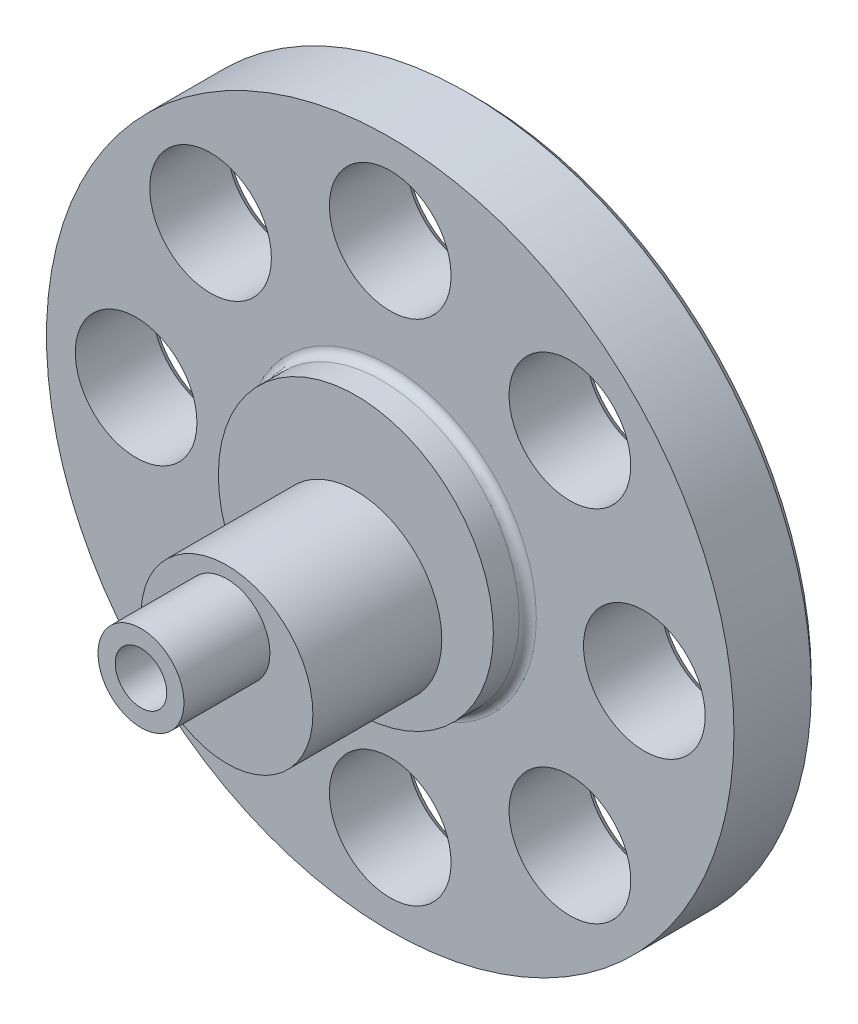
ISO-10303-21;
HEADER;
FILE_DESCRIPTION(('STEP AP214'),'2;1');
FILE_NAME('part.step','',(''),(''),'','','');
FILE_SCHEMA(('AUTOMOTIVE_DESIGN { 1 0 10303 214 1 1 1 1 }'));
ENDSEC;
DATA;
#1=APPLICATION_CONTEXT('core data for automotive mechanical design processes');
#2=APPLICATION_PROTOCOL_DEFINITION('international standard','automotive_design',2000,#1);
#3=PRODUCT_CONTEXT('',#1,'mechanical');
#4=PRODUCT('Part','Part','',(#3));
#5=PRODUCT_RELATED_PRODUCT_CATEGORY('part','',(#4));
#6=PRODUCT_DEFINITION_FORMATION('','',#4);
#7=PRODUCT_DEFINITION_CONTEXT('part definition',#1,'design');
#8=PRODUCT_DEFINITION('design','',#6,#7);
#9=PRODUCT_DEFINITION_SHAPE('','',#8);
#10=(LENGTH_UNIT() NAMED_UNIT(*) SI_UNIT(.MILLI.,.METRE.));
#11=(NAMED_UNIT(*) PLANE_ANGLE_UNIT() SI_UNIT($,.RADIAN.));
#12=(NAMED_UNIT(*) SI_UNIT($,.STERADIAN.) SOLID_ANGLE_UNIT());
#13=UNCERTAINTY_MEASURE_WITH_UNIT(LENGTH_MEASURE(1.E-05),#10,'distance_accuracy_value','');
#14=(GEOMETRIC_REPRESENTATION_CONTEXT(3) GLOBAL_UNCERTAINTY_ASSIGNED_CONTEXT((#13)) GLOBAL_UNIT_ASSIGNED_CONTEXT((#10,
#11,#12)) REPRESENTATION_CONTEXT('',''));
#15=CARTESIAN_POINT('',(0.,0.,0.));
#16=DIRECTION('',(0.,0.,1.));
#17=DIRECTION('',(1.,0.,0.));
#18=AXIS2_PLACEMENT_3D('',#15,#16,#17);
#19=CARTESIAN_POINT('',(0.,0.,5.));
#20=DIRECTION('',(0.,0.,1.));
#21=DIRECTION('',(1.,0.,0.));
#22=AXIS2_PLACEMENT_3D('',#19,#20,#21);
#23=PLANE('',#22);
#24=CARTESIAN_POINT('',(0.,0.,5.));
#25=DIRECTION('',(0.,0.,1.));
#26=DIRECTION('',(1.,0.,0.));
#27=AXIS2_PLACEMENT_3D('',#24,#25,#26);
#28=CIRCLE('',#27,8.5);
#29=CARTESIAN_POINT('',(8.5,0.,5.));
#30=VERTEX_POINT('',#29);
#31=EDGE_CURVE('E104',#30,#30,#28,.F.);
#32=ORIENTED_EDGE('',*,*,#31,.T.);
#33=EDGE_LOOP('',(#32));
#34=FACE_BOUND('',#33,.T.);
#35=CARTESIAN_POINT('',(0.,14.783956386368,5.));
#36=DIRECTION('',(0.,0.,1.));
#37=DIRECTION('',(1.,0.,0.));
#38=AXIS2_PLACEMENT_3D('',#35,#36,#37);
#39=CIRCLE('',#38,3.54);
#40=CARTESIAN_POINT('',(3.54,14.783956386368,5.));
#41=VERTEX_POINT('',#40);
#42=EDGE_CURVE('E133',#41,#41,#39,.T.);
#43=ORIENTED_EDGE('',*,*,#42,.F.);
#44=EDGE_LOOP('',(#43));
#45=FACE_BOUND('',#44,.T.);
#46=CARTESIAN_POINT('',(14.783956386368,0.,5.));
#47=DIRECTION('',(0.,0.,1.));
#48=DIRECTION('',(1.,0.,0.));
#49=AXIS2_PLACEMENT_3D('',#46,#47,#48);
#50=CIRCLE('',#49,3.54);
#51=CARTESIAN_POINT('',(18.323956386368,0.,5.));
#52=VERTEX_POINT('',#51);
#53=EDGE_CURVE('E127',#52,#52,#50,.T.);
#54=ORIENTED_EDGE('',*,*,#53,.F.);
#55=EDGE_LOOP('',(#54));
#56=FACE_BOUND('',#55,.T.);
#57=CARTESIAN_POINT('',(0.,-14.783956386368,5.));
#58=DIRECTION('',(0.,0.,1.));
#59=DIRECTION('',(1.,0.,0.));
#60=AXIS2_PLACEMENT_3D('',#57,#58,#59);
#61=CIRCLE('',#60,3.54);
#62=CARTESIAN_POINT('',(3.54,-14.783956386368,5.));
#63=VERTEX_POINT('',#62);
#64=EDGE_CURVE('E121',#63,#63,#61,.T.);
#65=ORIENTED_EDGE('',*,*,#64,.F.);
#66=EDGE_LOOP('',(#65));
#67=FACE_BOUND('',#66,.T.);
#68=CARTESIAN_POINT('',(-14.783956386368,0.,5.));
#69=DIRECTION('',(0.,0.,1.));
#70=DIRECTION('',(1.,0.,0.));
#71=AXIS2_PLACEMENT_3D('',#68,#69,#70);
#72=CIRCLE('',#71,3.54);
#73=CARTESIAN_POINT('',(-11.243956386368,0.,5.));
#74=VERTEX_POINT('',#73);
#75=EDGE_CURVE('E115',#74,#74,#72,.T.);
#76=ORIENTED_EDGE('',*,*,#75,.F.);
#77=EDGE_LOOP('',(#76));
#78=FACE_BOUND('',#77,.T.);
#79=CARTESIAN_POINT('',(0.,0.,5.));
#80=DIRECTION('',(0.,0.,1.));
#81=DIRECTION('',(1.,0.,0.));
#82=AXIS2_PLACEMENT_3D('',#79,#80,#81);
#83=CIRCLE('',#82,20.);
#84=CARTESIAN_POINT('',(20.,0.,5.));
#85=VERTEX_POINT('',#84);
#86=EDGE_CURVE('E111',#85,#85,#83,.T.);
#87=ORIENTED_EDGE('',*,*,#86,.T.);
#88=EDGE_LOOP('',(#87));
#89=FACE_BOUND('',#88,.T.);
#90=CARTESIAN_POINT('',(-10.453835813567,-10.453835813567,5.));
#91=DIRECTION('',(0.,0.,1.));
#92=DIRECTION('',(1.,0.,0.));
#93=AXIS2_PLACEMENT_3D('',#90,#91,#92);
#94=CIRCLE('',#93,3.54);
#95=CARTESIAN_POINT('',(-6.913835813567,-10.453835813567,5.));
#96=VERTEX_POINT('',#95);
#97=EDGE_CURVE('E118',#96,#96,#94,.T.);
#98=ORIENTED_EDGE('',*,*,#97,.F.);
#99=EDGE_LOOP('',(#98));
#100=FACE_BOUND('',#99,.T.);
#101=CARTESIAN_POINT('',(10.453835813567,-10.453835813567,5.));
#102=DIRECTION('',(0.,0.,1.));
#103=DIRECTION('',(1.,0.,0.));
#104=AXIS2_PLACEMENT_3D('',#101,#102,#103);
#105=CIRCLE('',#104,3.54);
#106=CARTESIAN_POINT('',(13.993835813567,-10.453835813567,5.));
#107=VERTEX_POINT('',#106);
#108=EDGE_CURVE('E124',#107,#107,#105,.T.);
#109=ORIENTED_EDGE('',*,*,#108,.F.);
#110=EDGE_LOOP('',(#109));
#111=FACE_BOUND('',#110,.T.);
#112=CARTESIAN_POINT('',(10.453835813567,10.453835813567,5.));
#113=DIRECTION('',(0.,0.,1.));
#114=DIRECTION('',(1.,0.,0.));
#115=AXIS2_PLACEMENT_3D('',#112,#113,#114);
#116=CIRCLE('',#115,3.54);
#117=CARTESIAN_POINT('',(13.993835813567,10.453835813567,5.));
#118=VERTEX_POINT('',#117);
#119=EDGE_CURVE('E130',#118,#118,#116,.T.);
#120=ORIENTED_EDGE('',*,*,#119,.F.);
#121=EDGE_LOOP('',(#120));
#122=FACE_BOUND('',#121,.T.);
#123=CARTESIAN_POINT('',(-10.453835813567,10.453835813567,5.));
#124=DIRECTION('',(0.,0.,1.));
#125=DIRECTION('',(1.,0.,0.));
#126=AXIS2_PLACEMENT_3D('',#123,#124,#125);
#127=CIRCLE('',#126,3.54);
#128=CARTESIAN_POINT('',(-6.913835813567,10.453835813567,5.));
#129=VERTEX_POINT('',#128);
#130=EDGE_CURVE('E136',#129,#129,#127,.T.);
#131=ORIENTED_EDGE('',*,*,#130,.F.);
#132=EDGE_LOOP('',(#131));
#133=FACE_BOUND('',#132,.T.);
#134=ADVANCED_FACE('F35',(#34,#45,#56,#67,#78,#89,#100,#111,#122,#133),#23,.T.);
#135=CARTESIAN_POINT('',(0.,0.,0.));
#136=DIRECTION('',(0.,0.,1.));
#137=DIRECTION('',(1.,0.,0.));
#138=AXIS2_PLACEMENT_3D('',#135,#136,#137);
#139=PLANE('',#138);
#140=CARTESIAN_POINT('',(-10.453835813567,10.453835813567,0.));
#141=DIRECTION('',(0.,0.,1.));
#142=DIRECTION('',(1.,0.,0.));
#143=AXIS2_PLACEMENT_3D('',#140,#141,#142);
#144=CIRCLE('',#143,4.04);
#145=CARTESIAN_POINT('',(-6.413835813567,10.453835813567,0.));
#146=VERTEX_POINT('',#145);
#147=EDGE_CURVE('E74',#146,#146,#144,.T.);
#148=ORIENTED_EDGE('',*,*,#147,.T.);
#149=EDGE_LOOP('',(#148));
#150=FACE_BOUND('',#149,.T.);
#151=CARTESIAN_POINT('',(0.,14.783956386368,0.));
#152=DIRECTION('',(0.,0.,1.));
#153=DIRECTION('',(1.,0.,0.));
#154=AXIS2_PLACEMENT_3D('',#151,#152,#153);
#155=CIRCLE('',#154,4.04);
#156=CARTESIAN_POINT('',(4.04,14.783956386368,0.));
#157=VERTEX_POINT('',#156);
#158=EDGE_CURVE('E77',#157,#157,#155,.T.);
#159=ORIENTED_EDGE('',*,*,#158,.T.);
#160=EDGE_LOOP('',(#159));
#161=FACE_BOUND('',#160,.T.);
#162=CARTESIAN_POINT('',(10.453835813567,10.453835813567,0.));
#163=DIRECTION('',(0.,0.,1.));
#164=DIRECTION('',(1.,0.,0.));
#165=AXIS2_PLACEMENT_3D('',#162,#163,#164);
#166=CIRCLE('',#165,4.04);
#167=CARTESIAN_POINT('',(14.493835813567,10.453835813567,0.));
#168=VERTEX_POINT('',#167);
#169=EDGE_CURVE('E80',#168,#168,#166,.T.);
#170=ORIENTED_EDGE('',*,*,#169,.T.);
#171=EDGE_LOOP('',(#170));
#172=FACE_BOUND('',#171,.T.);
#173=CARTESIAN_POINT('',(14.783956386368,0.,0.));
#174=DIRECTION('',(0.,0.,1.));
#175=DIRECTION('',(1.,0.,0.));
#176=AXIS2_PLACEMENT_3D('',#173,#174,#175);
#177=CIRCLE('',#176,4.04);
#178=CARTESIAN_POINT('',(18.823956386368,0.,0.));
#179=VERTEX_POINT('',#178);
#180=EDGE_CURVE('E83',#179,#179,#177,.T.);
#181=ORIENTED_EDGE('',*,*,#180,.T.);
#182=EDGE_LOOP('',(#181));
#183=FACE_BOUND('',#182,.T.);
#184=CARTESIAN_POINT('',(10.453835813567,-10.453835813567,0.));
#185=DIRECTION('',(0.,0.,1.));
#186=DIRECTION('',(1.,0.,0.));
#187=AXIS2_PLACEMENT_3D('',#184,#185,#186);
#188=CIRCLE('',#187,4.04);
#189=CARTESIAN_POINT('',(14.493835813567,-10.453835813567,0.));
#190=VERTEX_POINT('',#189);
#191=EDGE_CURVE('E86',#190,#190,#188,.T.);
#192=ORIENTED_EDGE('',*,*,#191,.T.);
#193=EDGE_LOOP('',(#192));
#194=FACE_BOUND('',#193,.T.);
#195=CARTESIAN_POINT('',(0.,-14.783956386368,0.));
#196=DIRECTION('',(0.,0.,1.));
#197=DIRECTION('',(1.,0.,0.));
#198=AXIS2_PLACEMENT_3D('',#195,#196,#197);
#199=CIRCLE('',#198,4.04);
#200=CARTESIAN_POINT('',(4.04,-14.783956386368,0.));
#201=VERTEX_POINT('',#200);
#202=EDGE_CURVE('E89',#201,#201,#199,.T.);
#203=ORIENTED_EDGE('',*,*,#202,.T.);
#204=EDGE_LOOP('',(#203));
#205=FACE_BOUND('',#204,.T.);
#206=CARTESIAN_POINT('',(-10.453835813567,-10.453835813567,0.));
#207=DIRECTION('',(0.,0.,1.));
#208=DIRECTION('',(1.,0.,0.));
#209=AXIS2_PLACEMENT_3D('',#206,#207,#208);
#210=CIRCLE('',#209,4.04);
#211=CARTESIAN_POINT('',(-6.413835813567,-10.453835813567,0.));
#212=VERTEX_POINT('',#211);
#213=EDGE_CURVE('E92',#212,#212,#210,.T.);
#214=ORIENTED_EDGE('',*,*,#213,.T.);
#215=EDGE_LOOP('',(#214));
#216=FACE_BOUND('',#215,.T.);
#217=CARTESIAN_POINT('',(-14.783956386368,0.,0.));
#218=DIRECTION('',(0.,0.,1.));
#219=DIRECTION('',(1.,0.,0.));
#220=AXIS2_PLACEMENT_3D('',#217,#218,#219);
#221=CIRCLE('',#220,4.04);
#222=CARTESIAN_POINT('',(-10.743956386368,0.,0.));
#223=VERTEX_POINT('',#222);
#224=EDGE_CURVE('E95',#223,#223,#221,.T.);
#225=ORIENTED_EDGE('',*,*,#224,.T.);
#226=EDGE_LOOP('',(#225));
#227=FACE_BOUND('',#226,.T.);
#228=CARTESIAN_POINT('',(0.,0.,0.));
#229=DIRECTION('',(0.,0.,1.));
#230=DIRECTION('',(1.,0.,0.));
#231=AXIS2_PLACEMENT_3D('',#228,#229,#230);
#232=CIRCLE('',#231,19.5);
#233=CARTESIAN_POINT('',(19.5,0.,0.));
#234=VERTEX_POINT('',#233);
#235=EDGE_CURVE('E98',#234,#234,#232,.F.);
#236=ORIENTED_EDGE('',*,*,#235,.T.);
#237=EDGE_LOOP('',(#236));
#238=FACE_BOUND('',#237,.T.);
#239=CARTESIAN_POINT('',(0.,0.,0.));
#240=DIRECTION('',(0.,0.,1.));
#241=DIRECTION('',(1.,0.,0.));
#242=AXIS2_PLACEMENT_3D('',#239,#240,#241);
#243=CIRCLE('',#242,7.00000000000001);
#244=CARTESIAN_POINT('',(7.00000000000001,0.,0.));
#245=VERTEX_POINT('',#244);
#246=EDGE_CURVE('E101',#245,#245,#243,.T.);
#247=ORIENTED_EDGE('',*,*,#246,.T.);
#248=EDGE_LOOP('',(#247));
#249=FACE_BOUND('',#248,.T.);
#250=ADVANCED_FACE('F209',(#150,#161,#172,#183,#194,#205,#216,#227,#238,#249),#139,.F.);
#251=CARTESIAN_POINT('',(0.,0.,5.));
#252=DIRECTION('',(0.,0.,-1.));
#253=DIRECTION('',(-1.,0.,0.));
#254=AXIS2_PLACEMENT_3D('',#251,#252,#253);
#255=CYLINDRICAL_SURFACE('',#254,20.);
#256=CARTESIAN_POINT('',(0.,0.,0.499999999999994));
#257=DIRECTION('',(0.,0.,1.));
#258=DIRECTION('',(1.,0.,0.));
#259=AXIS2_PLACEMENT_3D('',#256,#257,#258);
#260=CIRCLE('',#259,20.);
#261=CARTESIAN_POINT('',(20.,0.,0.499999999999994));
#262=VERTEX_POINT('',#261);
#263=EDGE_CURVE('E43',#262,#262,#260,.T.);
#264=ORIENTED_EDGE('',*,*,#263,.T.);
#265=EDGE_LOOP('',(#264));
#266=FACE_BOUND('',#265,.T.);
#267=ORIENTED_EDGE('',*,*,#86,.F.);
#268=EDGE_LOOP('',(#267));
#269=FACE_BOUND('',#268,.T.);
#270=ADVANCED_FACE('F215',(#266,#269),#255,.T.);
#271=CARTESIAN_POINT('',(-14.783956386368,0.,5.));
#272=DIRECTION('',(0.,0.,-1.));
#273=DIRECTION('',(-1.,0.,0.));
#274=AXIS2_PLACEMENT_3D('',#271,#272,#273);
#275=CYLINDRICAL_SURFACE('',#274,3.54);
#276=CARTESIAN_POINT('',(-14.783956386368,0.,0.500000000000008));
#277=DIRECTION('',(0.,0.,1.));
#278=DIRECTION('',(1.,0.,0.));
#279=AXIS2_PLACEMENT_3D('',#276,#277,#278);
#280=CIRCLE('',#279,3.54);
#281=CARTESIAN_POINT('',(-11.243956386368,0.,0.500000000000008));
#282=VERTEX_POINT('',#281);
#283=EDGE_CURVE('E47',#282,#282,#280,.F.);
#284=ORIENTED_EDGE('',*,*,#283,.T.);
#285=EDGE_LOOP('',(#284));
#286=FACE_BOUND('',#285,.T.);
#287=ORIENTED_EDGE('',*,*,#75,.T.);
#288=EDGE_LOOP('',(#287));
#289=FACE_BOUND('',#288,.T.);
#290=ADVANCED_FACE('F220',(#286,#289),#275,.F.);
#291=CARTESIAN_POINT('',(-10.453835813567,-10.453835813567,5.));
#292=DIRECTION('',(0.,0.,-1.));
#293=DIRECTION('',(-1.,0.,0.));
#294=AXIS2_PLACEMENT_3D('',#291,#292,#293);
#295=CYLINDRICAL_SURFACE('',#294,3.54);
#296=CARTESIAN_POINT('',(-10.453835813567,-10.453835813567,0.500000000000004));
#297=DIRECTION('',(0.,0.,1.));
#298=DIRECTION('',(1.,0.,0.));
#299=AXIS2_PLACEMENT_3D('',#296,#297,#298);
#300=CIRCLE('',#299,3.54);
#301=CARTESIAN_POINT('',(-6.913835813567,-10.453835813567,0.500000000000004));
#302=VERTEX_POINT('',#301);
#303=EDGE_CURVE('E51',#302,#302,#300,.F.);
#304=ORIENTED_EDGE('',*,*,#303,.T.);
#305=EDGE_LOOP('',(#304));
#306=FACE_BOUND('',#305,.T.);
#307=ORIENTED_EDGE('',*,*,#97,.T.);
#308=EDGE_LOOP('',(#307));
#309=FACE_BOUND('',#308,.T.);
#310=ADVANCED_FACE('F474',(#306,#309),#295,.F.);
#311=CARTESIAN_POINT('',(0.,-14.783956386368,5.));
#312=DIRECTION('',(0.,0.,-1.));
#313=DIRECTION('',(-1.,0.,0.));
#314=AXIS2_PLACEMENT_3D('',#311,#312,#313);
#315=CYLINDRICAL_SURFACE('',#314,3.54);
#316=CARTESIAN_POINT('',(0.,-14.783956386368,0.500000000000003));
#317=DIRECTION('',(0.,0.,1.));
#318=DIRECTION('',(1.,0.,0.));
#319=AXIS2_PLACEMENT_3D('',#316,#317,#318);
#320=CIRCLE('',#319,3.54);
#321=CARTESIAN_POINT('',(3.54,-14.783956386368,0.500000000000003));
#322=VERTEX_POINT('',#321);
#323=EDGE_CURVE('E56',#322,#322,#320,.F.);
#324=ORIENTED_EDGE('',*,*,#323,.T.);
#325=EDGE_LOOP('',(#324));
#326=FACE_BOUND('',#325,.T.);
#327=ORIENTED_EDGE('',*,*,#64,.T.);
#328=EDGE_LOOP('',(#327));
#329=FACE_BOUND('',#328,.T.);
#330=ADVANCED_FACE('F465',(#326,#329),#315,.F.);
#331=CARTESIAN_POINT('',(10.453835813567,-10.453835813567,5.));
#332=DIRECTION('',(0.,0.,-1.));
#333=DIRECTION('',(-1.,0.,0.));
#334=AXIS2_PLACEMENT_3D('',#331,#332,#333);
#335=CYLINDRICAL_SURFACE('',#334,3.54);
#336=CARTESIAN_POINT('',(10.453835813567,-10.453835813567,0.500000000000003));
#337=DIRECTION('',(0.,0.,1.));
#338=DIRECTION('',(1.,0.,0.));
#339=AXIS2_PLACEMENT_3D('',#336,#337,#338);
#340=CIRCLE('',#339,3.54);
#341=CARTESIAN_POINT('',(13.993835813567,-10.453835813567,0.500000000000003));
#342=VERTEX_POINT('',#341);
#343=EDGE_CURVE('E59',#342,#342,#340,.F.);
#344=ORIENTED_EDGE('',*,*,#343,.T.);
#345=EDGE_LOOP('',(#344));
#346=FACE_BOUND('',#345,.T.);
#347=ORIENTED_EDGE('',*,*,#108,.T.);
#348=EDGE_LOOP('',(#347));
#349=FACE_BOUND('',#348,.T.);
#350=ADVANCED_FACE('F456',(#346,#349),#335,.F.);
#351=CARTESIAN_POINT('',(14.783956386368,0.,5.));
#352=DIRECTION('',(0.,0.,-1.));
#353=DIRECTION('',(-1.,0.,0.));
#354=AXIS2_PLACEMENT_3D('',#351,#352,#353);
#355=CYLINDRICAL_SURFACE('',#354,3.54);
#356=CARTESIAN_POINT('',(14.783956386368,0.,0.500000000000005));
#357=DIRECTION('',(0.,0.,1.));
#358=DIRECTION('',(1.,0.,0.));
#359=AXIS2_PLACEMENT_3D('',#356,#357,#358);
#360=CIRCLE('',#359,3.54);
#361=CARTESIAN_POINT('',(18.323956386368,0.,0.500000000000005));
#362=VERTEX_POINT('',#361);
#363=EDGE_CURVE('E62',#362,#362,#360,.F.);
#364=ORIENTED_EDGE('',*,*,#363,.T.);
#365=EDGE_LOOP('',(#364));
#366=FACE_BOUND('',#365,.T.);
#367=ORIENTED_EDGE('',*,*,#53,.T.);
#368=EDGE_LOOP('',(#367));
#369=FACE_BOUND('',#368,.T.);
#370=ADVANCED_FACE('F447',(#366,#369),#355,.F.);
#371=CARTESIAN_POINT('',(10.453835813567,10.453835813567,5.));
#372=DIRECTION('',(0.,0.,-1.));
#373=DIRECTION('',(-1.,0.,0.));
#374=AXIS2_PLACEMENT_3D('',#371,#372,#373);
#375=CYLINDRICAL_SURFACE('',#374,3.54);
#376=CARTESIAN_POINT('',(10.453835813567,10.453835813567,0.500000000000003));
#377=DIRECTION('',(0.,0.,1.));
#378=DIRECTION('',(1.,0.,0.));
#379=AXIS2_PLACEMENT_3D('',#376,#377,#378);
#380=CIRCLE('',#379,3.54);
#381=CARTESIAN_POINT('',(13.993835813567,10.453835813567,0.500000000000003));
#382=VERTEX_POINT('',#381);
#383=EDGE_CURVE('E65',#382,#382,#380,.F.);
#384=ORIENTED_EDGE('',*,*,#383,.T.);
#385=EDGE_LOOP('',(#384));
#386=FACE_BOUND('',#385,.T.);
#387=ORIENTED_EDGE('',*,*,#119,.T.);
#388=EDGE_LOOP('',(#387));
#389=FACE_BOUND('',#388,.T.);
#390=ADVANCED_FACE('F438',(#386,#389),#375,.F.);
#391=CARTESIAN_POINT('',(0.,14.783956386368,5.));
#392=DIRECTION('',(0.,0.,-1.));
#393=DIRECTION('',(-1.,0.,0.));
#394=AXIS2_PLACEMENT_3D('',#391,#392,#393);
#395=CYLINDRICAL_SURFACE('',#394,3.54);
#396=CARTESIAN_POINT('',(0.,14.783956386368,0.500000000000003));
#397=DIRECTION('',(0.,0.,1.));
#398=DIRECTION('',(1.,0.,0.));
#399=AXIS2_PLACEMENT_3D('',#396,#397,#398);
#400=CIRCLE('',#399,3.54);
#401=CARTESIAN_POINT('',(3.54,14.783956386368,0.500000000000003));
#402=VERTEX_POINT('',#401);
#403=EDGE_CURVE('E68',#402,#402,#400,.F.);
#404=ORIENTED_EDGE('',*,*,#403,.T.);
#405=EDGE_LOOP('',(#404));
#406=FACE_BOUND('',#405,.T.);
#407=ORIENTED_EDGE('',*,*,#42,.T.);
#408=EDGE_LOOP('',(#407));
#409=FACE_BOUND('',#408,.T.);
#410=ADVANCED_FACE('F205',(#406,#409),#395,.F.);
#411=CARTESIAN_POINT('',(-10.453835813567,10.453835813567,5.));
#412=DIRECTION('',(0.,0.,-1.));
#413=DIRECTION('',(-1.,0.,0.));
#414=AXIS2_PLACEMENT_3D('',#411,#412,#413);
#415=CYLINDRICAL_SURFACE('',#414,3.54);
#416=CARTESIAN_POINT('',(-10.453835813567,10.453835813567,0.500000000000004));
#417=DIRECTION('',(0.,0.,1.));
#418=DIRECTION('',(1.,0.,0.));
#419=AXIS2_PLACEMENT_3D('',#416,#417,#418);
#420=CIRCLE('',#419,3.54);
#421=CARTESIAN_POINT('',(-6.913835813567,10.453835813567,0.500000000000004));
#422=VERTEX_POINT('',#421);
#423=EDGE_CURVE('E71',#422,#422,#420,.F.);
#424=ORIENTED_EDGE('',*,*,#423,.T.);
#425=EDGE_LOOP('',(#424));
#426=FACE_BOUND('',#425,.T.);
#427=ORIENTED_EDGE('',*,*,#130,.T.);
#428=EDGE_LOOP('',(#427));
#429=FACE_BOUND('',#428,.T.);
#430=ADVANCED_FACE('F199',(#426,#429),#415,.F.);
#431=CARTESIAN_POINT('',(0.,0.,7.));
#432=DIRECTION('',(0.,0.,-1.));
#433=DIRECTION('',(-1.,0.,0.));
#434=AXIS2_PLACEMENT_3D('',#431,#432,#433);
#435=CYLINDRICAL_SURFACE('',#434,8.);
#436=CARTESIAN_POINT('',(0.,0.,5.5));
#437=DIRECTION('',(0.,0.,1.));
#438=DIRECTION('',(1.,0.,0.));
#439=AXIS2_PLACEMENT_3D('',#436,#437,#438);
#440=CIRCLE('',#439,8.);
#441=CARTESIAN_POINT('',(8.,0.,5.5));
#442=VERTEX_POINT('',#441);
#443=EDGE_CURVE('E107',#442,#442,#440,.T.);
#444=ORIENTED_EDGE('',*,*,#443,.T.);
#445=EDGE_LOOP('',(#444));
#446=FACE_BOUND('',#445,.T.);
#447=CARTESIAN_POINT('',(0.,0.,7.));
#448=DIRECTION('',(0.,0.,1.));
#449=DIRECTION('',(1.,0.,0.));
#450=AXIS2_PLACEMENT_3D('',#447,#448,#449);
#451=CIRCLE('',#450,8.);
#452=CARTESIAN_POINT('',(8.,0.,7.));
#453=VERTEX_POINT('',#452);
#454=EDGE_CURVE('E139',#453,#453,#451,.T.);
#455=ORIENTED_EDGE('',*,*,#454,.F.);
#456=EDGE_LOOP('',(#455));
#457=FACE_BOUND('',#456,.T.);
#458=ADVANCED_FACE('F194',(#446,#457),#435,.T.);
#459=CARTESIAN_POINT('',(0.,0.,7.));
#460=DIRECTION('',(0.,0.,1.));
#461=DIRECTION('',(1.,0.,0.));
#462=AXIS2_PLACEMENT_3D('',#459,#460,#461);
#463=PLANE('',#462);
#464=CARTESIAN_POINT('',(0.,-1.812,7.));
#465=DIRECTION('',(0.,0.,1.));
#466=DIRECTION('',(1.,0.,0.));
#467=AXIS2_PLACEMENT_3D('',#464,#465,#466);
#468=CIRCLE('',#467,5.);
#469=CARTESIAN_POINT('',(5.,-1.812,7.));
#470=VERTEX_POINT('',#469);
#471=EDGE_CURVE('E114',#470,#470,#468,.T.);
#472=ORIENTED_EDGE('',*,*,#471,.F.);
#473=EDGE_LOOP('',(#472));
#474=FACE_BOUND('',#473,.T.);
#475=ORIENTED_EDGE('',*,*,#454,.T.);
#476=EDGE_LOOP('',(#475));
#477=FACE_BOUND('',#476,.T.);
#478=ADVANCED_FACE('F190',(#474,#477),#463,.T.);
#479=CARTESIAN_POINT('',(0.,0.,6.));
#480=DIRECTION('',(0.,0.,-1.));
#481=DIRECTION('',(-1.,0.,0.));
#482=AXIS2_PLACEMENT_3D('',#479,#480,#481);
#483=CYLINDRICAL_SURFACE('',#482,6.5);
#484=CARTESIAN_POINT('',(0.,0.,0.500000000000007));
#485=DIRECTION('',(0.,0.,1.));
#486=DIRECTION('',(1.,0.,0.));
#487=AXIS2_PLACEMENT_3D('',#484,#485,#486);
#488=CIRCLE('',#487,6.5);
#489=CARTESIAN_POINT('',(6.5,0.,0.500000000000007));
#490=VERTEX_POINT('',#489);
#491=EDGE_CURVE('E10',#490,#490,#488,.F.);
#492=ORIENTED_EDGE('',*,*,#491,.T.);
#493=EDGE_LOOP('',(#492));
#494=FACE_BOUND('',#493,.T.);
#495=CARTESIAN_POINT('',(0.,0.,6.));
#496=DIRECTION('',(0.,0.,-1.));
#497=DIRECTION('',(-1.,0.,0.));
#498=AXIS2_PLACEMENT_3D('',#495,#496,#497);
#499=CIRCLE('',#498,6.5);
#500=CARTESIAN_POINT('',(-6.5,0.,6.));
#501=VERTEX_POINT('',#500);
#502=EDGE_CURVE('E142',#501,#501,#499,.T.);
#503=ORIENTED_EDGE('',*,*,#502,.F.);
#504=EDGE_LOOP('',(#503));
#505=FACE_BOUND('',#504,.T.);
#506=ADVANCED_FACE('F193',(#494,#505),#483,.F.);
#507=CARTESIAN_POINT('',(0.,0.,6.));
#508=DIRECTION('',(0.,0.,-1.));
#509=DIRECTION('',(-1.,0.,0.));
#510=AXIS2_PLACEMENT_3D('',#507,#508,#509);
#511=PLANE('',#510);
#512=CARTESIAN_POINT('',(0.,0.,6.));
#513=DIRECTION('',(0.,0.,-1.));
#514=DIRECTION('',(-1.,0.,0.));
#515=AXIS2_PLACEMENT_3D('',#512,#513,#514);
#516=CIRCLE('',#515,1.5);
#517=CARTESIAN_POINT('',(-1.5,0.,6.));
#518=VERTEX_POINT('',#517);
#519=EDGE_CURVE('E155',#518,#518,#516,.T.);
#520=ORIENTED_EDGE('',*,*,#519,.F.);
#521=EDGE_LOOP('',(#520));
#522=FACE_BOUND('',#521,.T.);
#523=ORIENTED_EDGE('',*,*,#502,.T.);
#524=EDGE_LOOP('',(#523));
#525=FACE_BOUND('',#524,.T.);
#526=ADVANCED_FACE('F186',(#522,#525),#511,.T.);
#527=CARTESIAN_POINT('',(0.,-1.812,14.5));
#528=DIRECTION('',(0.,0.,-1.));
#529=DIRECTION('',(-1.,0.,0.));
#530=AXIS2_PLACEMENT_3D('',#527,#528,#529);
#531=CYLINDRICAL_SURFACE('',#530,5.);
#532=CARTESIAN_POINT('',(0.,-1.812,14.5));
#533=DIRECTION('',(0.,0.,1.));
#534=DIRECTION('',(1.,0.,0.));
#535=AXIS2_PLACEMENT_3D('',#532,#533,#534);
#536=CIRCLE('',#535,5.);
#537=CARTESIAN_POINT('',(5.,-1.812,14.5));
#538=VERTEX_POINT('',#537);
#539=EDGE_CURVE('E145',#538,#538,#536,.T.);
#540=ORIENTED_EDGE('',*,*,#539,.F.);
#541=EDGE_LOOP('',(#540));
#542=FACE_BOUND('',#541,.T.);
#543=ORIENTED_EDGE('',*,*,#471,.T.);
#544=EDGE_LOOP('',(#543));
#545=FACE_BOUND('',#544,.T.);
#546=ADVANCED_FACE('F180',(#542,#545),#531,.T.);
#547=CARTESIAN_POINT('',(0.,-1.812,14.5));
#548=DIRECTION('',(0.,0.,1.));
#549=DIRECTION('',(1.,0.,0.));
#550=AXIS2_PLACEMENT_3D('',#547,#548,#549);
#551=PLANE('',#550);
#552=CARTESIAN_POINT('',(0.,0.,14.5));
#553=DIRECTION('',(0.,0.,1.));
#554=DIRECTION('',(1.,0.,0.));
#555=AXIS2_PLACEMENT_3D('',#552,#553,#554);
#556=CIRCLE('',#555,2.5);
#557=CARTESIAN_POINT('',(2.5,0.,14.5));
#558=VERTEX_POINT('',#557);
#559=EDGE_CURVE('E110',#558,#558,#556,.T.);
#560=ORIENTED_EDGE('',*,*,#559,.F.);
#561=EDGE_LOOP('',(#560));
#562=FACE_BOUND('',#561,.T.);
#563=ORIENTED_EDGE('',*,*,#539,.T.);
#564=EDGE_LOOP('',(#563));
#565=FACE_BOUND('',#564,.T.);
#566=ADVANCED_FACE('F174',(#562,#565),#551,.T.);
#567=CARTESIAN_POINT('',(0.,0.,19.5));
#568=DIRECTION('',(0.,0.,-1.));
#569=DIRECTION('',(-1.,0.,0.));
#570=AXIS2_PLACEMENT_3D('',#567,#568,#569);
#571=CYLINDRICAL_SURFACE('',#570,2.5);
#572=CARTESIAN_POINT('',(0.,0.,19.5));
#573=DIRECTION('',(0.,0.,1.));
#574=DIRECTION('',(1.,0.,0.));
#575=AXIS2_PLACEMENT_3D('',#572,#573,#574);
#576=CIRCLE('',#575,2.5);
#577=CARTESIAN_POINT('',(2.5,0.,19.5));
#578=VERTEX_POINT('',#577);
#579=EDGE_CURVE('E150',#578,#578,#576,.T.);
#580=ORIENTED_EDGE('',*,*,#579,.F.);
#581=EDGE_LOOP('',(#580));
#582=FACE_BOUND('',#581,.T.);
#583=ORIENTED_EDGE('',*,*,#559,.T.);
#584=EDGE_LOOP('',(#583));
#585=FACE_BOUND('',#584,.T.);
#586=ADVANCED_FACE('F168',(#582,#585),#571,.T.);
#587=CARTESIAN_POINT('',(0.,0.,19.5));
#588=DIRECTION('',(0.,0.,1.));
#589=DIRECTION('',(1.,0.,0.));
#590=AXIS2_PLACEMENT_3D('',#587,#588,#589);
#591=PLANE('',#590);
#592=CARTESIAN_POINT('',(0.,0.,19.5));
#593=DIRECTION('',(0.,0.,1.));
#594=DIRECTION('',(1.,0.,0.));
#595=AXIS2_PLACEMENT_3D('',#592,#593,#594);
#596=CIRCLE('',#595,1.5);
#597=CARTESIAN_POINT('',(1.5,0.,19.5));
#598=VERTEX_POINT('',#597);
#599=EDGE_CURVE('E158',#598,#598,#596,.T.);
#600=ORIENTED_EDGE('',*,*,#599,.F.);
#601=EDGE_LOOP('',(#600));
#602=FACE_BOUND('',#601,.T.);
#603=ORIENTED_EDGE('',*,*,#579,.T.);
#604=EDGE_LOOP('',(#603));
#605=FACE_BOUND('',#604,.T.);
#606=ADVANCED_FACE('F164',(#602,#605),#591,.T.);
#607=CARTESIAN_POINT('',(0.,0.,5.5));
#608=DIRECTION('',(0.,0.,1.));
#609=DIRECTION('',(1.,0.,0.));
#610=AXIS2_PLACEMENT_3D('',#607,#608,#609);
#611=TOROIDAL_SURFACE('',#610,8.5,0.5);
#612=ORIENTED_EDGE('',*,*,#31,.F.);
#613=EDGE_LOOP('',(#612));
#614=FACE_BOUND('',#613,.T.);
#615=ORIENTED_EDGE('',*,*,#443,.F.);
#616=EDGE_LOOP('',(#615));
#617=FACE_BOUND('',#616,.T.);
#618=ADVANCED_FACE('F167',(#614,#617),#611,.F.);
#619=CARTESIAN_POINT('',(-10.453835813567,10.453835813567,0.));
#620=DIRECTION('',(0.,0.,-1.));
#621=DIRECTION('',(-1.,0.,0.));
#622=AXIS2_PLACEMENT_3D('',#619,#620,#621);
#623=CONICAL_SURFACE('',#622,4.04,0.785398163397447);
#624=ORIENTED_EDGE('',*,*,#423,.F.);
#625=EDGE_LOOP('',(#624));
#626=FACE_BOUND('',#625,.T.);
#627=ORIENTED_EDGE('',*,*,#147,.F.);
#628=EDGE_LOOP('',(#627));
#629=FACE_BOUND('',#628,.T.);
#630=ADVANCED_FACE('F227',(#626,#629),#623,.F.);
#631=CARTESIAN_POINT('',(0.,14.783956386368,0.));
#632=DIRECTION('',(0.,0.,-1.));
#633=DIRECTION('',(-1.,0.,0.));
#634=AXIS2_PLACEMENT_3D('',#631,#632,#633);
#635=CONICAL_SURFACE('',#634,4.04,0.785398163397447);
#636=ORIENTED_EDGE('',*,*,#403,.F.);
#637=EDGE_LOOP('',(#636));
#638=FACE_BOUND('',#637,.T.);
#639=ORIENTED_EDGE('',*,*,#158,.F.);
#640=EDGE_LOOP('',(#639));
#641=FACE_BOUND('',#640,.T.);
#642=ADVANCED_FACE('F235',(#638,#641),#635,.F.);
#643=CARTESIAN_POINT('',(10.453835813567,10.453835813567,0.));
#644=DIRECTION('',(0.,0.,-1.));
#645=DIRECTION('',(-1.,0.,0.));
#646=AXIS2_PLACEMENT_3D('',#643,#644,#645);
#647=CONICAL_SURFACE('',#646,4.04,0.785398163397447);
#648=ORIENTED_EDGE('',*,*,#383,.F.);
#649=EDGE_LOOP('',(#648));
#650=FACE_BOUND('',#649,.T.);
#651=ORIENTED_EDGE('',*,*,#169,.F.);
#652=EDGE_LOOP('',(#651));
#653=FACE_BOUND('',#652,.T.);
#654=ADVANCED_FACE('F242',(#650,#653),#647,.F.);
#655=CARTESIAN_POINT('',(14.783956386368,0.,0.));
#656=DIRECTION('',(0.,0.,-1.));
#657=DIRECTION('',(-1.,0.,0.));
#658=AXIS2_PLACEMENT_3D('',#655,#656,#657);
#659=CONICAL_SURFACE('',#658,4.04,0.785398163397447);
#660=ORIENTED_EDGE('',*,*,#363,.F.);
#661=EDGE_LOOP('',(#660));
#662=FACE_BOUND('',#661,.T.);
#663=ORIENTED_EDGE('',*,*,#180,.F.);
#664=EDGE_LOOP('',(#663));
#665=FACE_BOUND('',#664,.T.);
#666=ADVANCED_FACE('F249',(#662,#665),#659,.F.);
#667=CARTESIAN_POINT('',(10.453835813567,-10.453835813567,0.));
#668=DIRECTION('',(0.,0.,-1.));
#669=DIRECTION('',(-1.,0.,0.));
#670=AXIS2_PLACEMENT_3D('',#667,#668,#669);
#671=CONICAL_SURFACE('',#670,4.04,0.785398163397447);
#672=ORIENTED_EDGE('',*,*,#343,.F.);
#673=EDGE_LOOP('',(#672));
#674=FACE_BOUND('',#673,.T.);
#675=ORIENTED_EDGE('',*,*,#191,.F.);
#676=EDGE_LOOP('',(#675));
#677=FACE_BOUND('',#676,.T.);
#678=ADVANCED_FACE('F256',(#674,#677),#671,.F.);
#679=CARTESIAN_POINT('',(0.,-14.783956386368,0.));
#680=DIRECTION('',(0.,0.,-1.));
#681=DIRECTION('',(-1.,0.,0.));
#682=AXIS2_PLACEMENT_3D('',#679,#680,#681);
#683=CONICAL_SURFACE('',#682,4.04,0.785398163397447);
#684=ORIENTED_EDGE('',*,*,#323,.F.);
#685=EDGE_LOOP('',(#684));
#686=FACE_BOUND('',#685,.T.);
#687=ORIENTED_EDGE('',*,*,#202,.F.);
#688=EDGE_LOOP('',(#687));
#689=FACE_BOUND('',#688,.T.);
#690=ADVANCED_FACE('F263',(#686,#689),#683,.F.);
#691=CARTESIAN_POINT('',(-10.453835813567,-10.453835813567,0.));
#692=DIRECTION('',(0.,0.,-1.));
#693=DIRECTION('',(-1.,0.,0.));
#694=AXIS2_PLACEMENT_3D('',#691,#692,#693);
#695=CONICAL_SURFACE('',#694,4.04,0.785398163397447);
#696=ORIENTED_EDGE('',*,*,#303,.F.);
#697=EDGE_LOOP('',(#696));
#698=FACE_BOUND('',#697,.T.);
#699=ORIENTED_EDGE('',*,*,#213,.F.);
#700=EDGE_LOOP('',(#699));
#701=FACE_BOUND('',#700,.T.);
#702=ADVANCED_FACE('F270',(#698,#701),#695,.F.);
#703=CARTESIAN_POINT('',(-14.783956386368,0.,0.));
#704=DIRECTION('',(0.,0.,-1.));
#705=DIRECTION('',(-1.,0.,0.));
#706=AXIS2_PLACEMENT_3D('',#703,#704,#705);
#707=CONICAL_SURFACE('',#706,4.04,0.785398163397438);
#708=ORIENTED_EDGE('',*,*,#283,.F.);
#709=EDGE_LOOP('',(#708));
#710=FACE_BOUND('',#709,.T.);
#711=ORIENTED_EDGE('',*,*,#224,.F.);
#712=EDGE_LOOP('',(#711));
#713=FACE_BOUND('',#712,.T.);
#714=ADVANCED_FACE('F277',(#710,#713),#707,.F.);
#715=CARTESIAN_POINT('',(0.,0.,0.499999999999994));
#716=DIRECTION('',(0.,0.,1.));
#717=DIRECTION('',(1.,0.,0.));
#718=AXIS2_PLACEMENT_3D('',#715,#716,#717);
#719=CONICAL_SURFACE('',#718,20.,0.785398163397452);
#720=ORIENTED_EDGE('',*,*,#235,.F.);
#721=EDGE_LOOP('',(#720));
#722=FACE_BOUND('',#721,.T.);
#723=ORIENTED_EDGE('',*,*,#263,.F.);
#724=EDGE_LOOP('',(#723));
#725=FACE_BOUND('',#724,.T.);
#726=ADVANCED_FACE('F283',(#722,#725),#719,.T.);
#727=CARTESIAN_POINT('',(0.,0.,0.500000000000007));
#728=DIRECTION('',(0.,0.,-1.));
#729=DIRECTION('',(-1.,0.,0.));
#730=AXIS2_PLACEMENT_3D('',#727,#728,#729);
#731=CONICAL_SURFACE('',#730,6.5,0.785398163397454);
#732=ORIENTED_EDGE('',*,*,#246,.F.);
#733=EDGE_LOOP('',(#732));
#734=FACE_BOUND('',#733,.T.);
#735=ORIENTED_EDGE('',*,*,#491,.F.);
#736=EDGE_LOOP('',(#735));
#737=FACE_BOUND('',#736,.T.);
#738=ADVANCED_FACE('F38',(#734,#737),#731,.F.);
#739=CARTESIAN_POINT('',(0.,0.,4.5));
#740=DIRECTION('',(0.,0.,1.));
#741=DIRECTION('',(1.,0.,0.));
#742=AXIS2_PLACEMENT_3D('',#739,#740,#741);
#743=CYLINDRICAL_SURFACE('',#742,1.5);
#744=ORIENTED_EDGE('',*,*,#519,.T.);
#745=EDGE_LOOP('',(#744));
#746=FACE_BOUND('',#745,.T.);
#747=ORIENTED_EDGE('',*,*,#599,.T.);
#748=EDGE_LOOP('',(#747));
#749=FACE_BOUND('',#748,.T.);
#750=ADVANCED_FACE('F162',(#746,#749),#743,.F.);
#751=CLOSED_SHELL('',(#134,#250,#270,#290,#310,#330,#350,#370,#390,#410,#430,#458,#478,#506,
#526,#546,#566,#586,#606,#618,#630,#642,#654,#666,#678,#690,#702,#714,#726,#738,#750));
#752=MANIFOLD_SOLID_BREP('B2',#751);
#753=ADVANCED_BREP_SHAPE_REPRESENTATION('',(#18,#752),#14);
#754=SHAPE_DEFINITION_REPRESENTATION(#9,#753);
ENDSEC;
END-ISO-10303-21;
